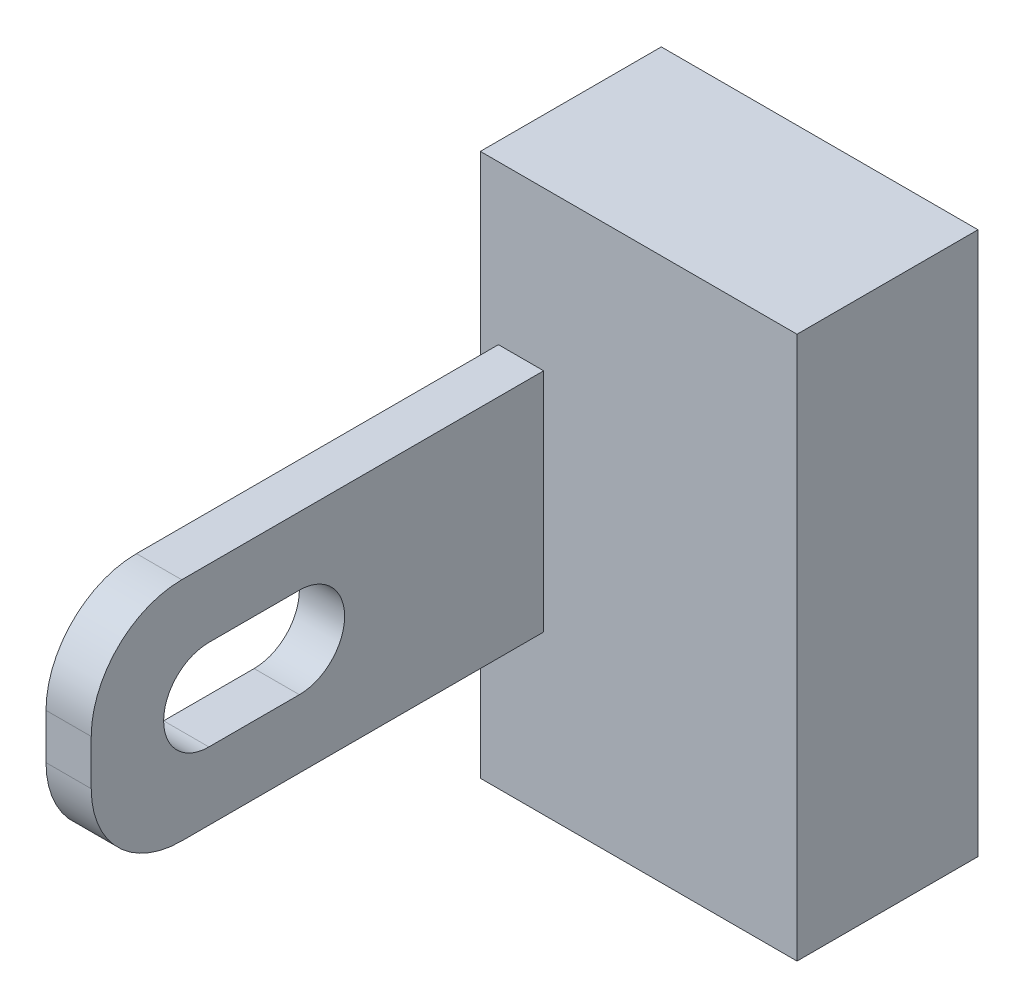
ISO-10303-21;
HEADER;
FILE_DESCRIPTION(('STEP AP214'),'2;1');
FILE_NAME('part.step','',(''),(''),'','','');
FILE_SCHEMA(('AUTOMOTIVE_DESIGN { 1 0 10303 214 1 1 1 1 }'));
ENDSEC;
DATA;
#1=APPLICATION_CONTEXT('core data for automotive mechanical design processes');
#2=APPLICATION_PROTOCOL_DEFINITION('international standard','automotive_design',2000,#1);
#3=PRODUCT_CONTEXT('',#1,'mechanical');
#4=PRODUCT('Part','Part','',(#3));
#5=PRODUCT_RELATED_PRODUCT_CATEGORY('part','',(#4));
#6=PRODUCT_DEFINITION_FORMATION('','',#4);
#7=PRODUCT_DEFINITION_CONTEXT('part definition',#1,'design');
#8=PRODUCT_DEFINITION('design','',#6,#7);
#9=PRODUCT_DEFINITION_SHAPE('','',#8);
#10=(LENGTH_UNIT() NAMED_UNIT(*) SI_UNIT(.MILLI.,.METRE.));
#11=(NAMED_UNIT(*) PLANE_ANGLE_UNIT() SI_UNIT($,.RADIAN.));
#12=(NAMED_UNIT(*) SI_UNIT($,.STERADIAN.) SOLID_ANGLE_UNIT());
#13=UNCERTAINTY_MEASURE_WITH_UNIT(LENGTH_MEASURE(1.E-05),#10,'distance_accuracy_value','');
#14=(GEOMETRIC_REPRESENTATION_CONTEXT(3) GLOBAL_UNCERTAINTY_ASSIGNED_CONTEXT((#13)) GLOBAL_UNIT_ASSIGNED_CONTEXT((#10,
#11,#12)) REPRESENTATION_CONTEXT('',''));
#15=CARTESIAN_POINT('',(0.,0.,0.));
#16=DIRECTION('',(0.,0.,1.));
#17=DIRECTION('',(1.,0.,0.));
#18=AXIS2_PLACEMENT_3D('',#15,#16,#17);
#19=CARTESIAN_POINT('',(0.,0.,2.));
#20=DIRECTION('',(0.,0.,1.));
#21=DIRECTION('',(1.,0.,0.));
#22=AXIS2_PLACEMENT_3D('',#19,#20,#21);
#23=PLANE('',#22);
#24=DIRECTION('',(0.,1.,0.));
#25=VECTOR('',#24,1.);
#26=CARTESIAN_POINT('',(1.75,3.,2.));
#27=LINE('',#26,#25);
#28=CARTESIAN_POINT('',(1.75,-3.,2.));
#29=VERTEX_POINT('',#28);
#30=CARTESIAN_POINT('',(1.75,3.,2.));
#31=VERTEX_POINT('',#30);
#32=EDGE_CURVE('E227',#29,#31,#27,.T.);
#33=ORIENTED_EDGE('',*,*,#32,.T.);
#34=DIRECTION('',(-1.,0.,0.));
#35=VECTOR('',#34,1.);
#36=CARTESIAN_POINT('',(-1.75,3.,2.));
#37=LINE('',#36,#35);
#38=CARTESIAN_POINT('',(-1.75,3.,2.));
#39=VERTEX_POINT('',#38);
#40=EDGE_CURVE('E231',#31,#39,#37,.T.);
#41=ORIENTED_EDGE('',*,*,#40,.T.);
#42=DIRECTION('',(0.,-1.,0.));
#43=VECTOR('',#42,1.);
#44=CARTESIAN_POINT('',(-1.75,3.,2.));
#45=LINE('',#44,#43);
#46=CARTESIAN_POINT('',(-1.75,-3.,2.));
#47=VERTEX_POINT('',#46);
#48=EDGE_CURVE('E235',#39,#47,#45,.T.);
#49=ORIENTED_EDGE('',*,*,#48,.T.);
#50=DIRECTION('',(1.,0.,0.));
#51=VECTOR('',#50,1.);
#52=CARTESIAN_POINT('',(-1.75,-3.,2.));
#53=LINE('',#52,#51);
#54=EDGE_CURVE('E238',#47,#29,#53,.T.);
#55=ORIENTED_EDGE('',*,*,#54,.T.);
#56=EDGE_LOOP('',(#33,#41,#49,#55));
#57=FACE_BOUND('',#56,.T.);
#58=DIRECTION('',(-1.,0.,0.));
#59=VECTOR('',#58,1.);
#60=CARTESIAN_POINT('',(-1.55,1.25,2.));
#61=LINE('',#60,#59);
#62=CARTESIAN_POINT('',(-1.05,1.25,2.));
#63=VERTEX_POINT('',#62);
#64=CARTESIAN_POINT('',(-1.55,1.25,2.));
#65=VERTEX_POINT('',#64);
#66=EDGE_CURVE('E204',#63,#65,#61,.T.);
#67=ORIENTED_EDGE('',*,*,#66,.F.);
#68=DIRECTION('',(0.,1.,0.));
#69=VECTOR('',#68,1.);
#70=CARTESIAN_POINT('',(-1.05,1.25,2.));
#71=LINE('',#70,#69);
#72=CARTESIAN_POINT('',(-1.05,-1.25,2.));
#73=VERTEX_POINT('',#72);
#74=EDGE_CURVE('E190',#73,#63,#71,.T.);
#75=ORIENTED_EDGE('',*,*,#74,.F.);
#76=DIRECTION('',(1.,0.,0.));
#77=VECTOR('',#76,1.);
#78=CARTESIAN_POINT('',(-1.55,-1.25,2.));
#79=LINE('',#78,#77);
#80=CARTESIAN_POINT('',(-1.55,-1.25,2.));
#81=VERTEX_POINT('',#80);
#82=EDGE_CURVE('E196',#81,#73,#79,.T.);
#83=ORIENTED_EDGE('',*,*,#82,.F.);
#84=DIRECTION('',(0.,-1.,0.));
#85=VECTOR('',#84,1.);
#86=CARTESIAN_POINT('',(-1.55,1.25,2.));
#87=LINE('',#86,#85);
#88=EDGE_CURVE('E208',#65,#81,#87,.T.);
#89=ORIENTED_EDGE('',*,*,#88,.F.);
#90=EDGE_LOOP('',(#67,#75,#83,#89));
#91=FACE_BOUND('',#90,.T.);
#92=ADVANCED_FACE('F41',(#57,#91),#23,.T.);
#93=CARTESIAN_POINT('',(1.75,3.,2.));
#94=DIRECTION('',(-1.,0.,0.));
#95=DIRECTION('',(0.,-1.,0.));
#96=AXIS2_PLACEMENT_3D('',#93,#94,#95);
#97=PLANE('',#96);
#98=DIRECTION('',(0.,1.,0.));
#99=VECTOR('',#98,1.);
#100=CARTESIAN_POINT('',(1.75,3.,0.));
#101=LINE('',#100,#99);
#102=CARTESIAN_POINT('',(1.75,-3.,0.));
#103=VERTEX_POINT('',#102);
#104=CARTESIAN_POINT('',(1.75,3.,0.));
#105=VERTEX_POINT('',#104);
#106=EDGE_CURVE('E226',#103,#105,#101,.T.);
#107=ORIENTED_EDGE('',*,*,#106,.T.);
#108=DIRECTION('',(0.,0.,-1.));
#109=VECTOR('',#108,1.);
#110=CARTESIAN_POINT('',(1.75,3.,2.));
#111=LINE('',#110,#109);
#112=EDGE_CURVE('E264',#31,#105,#111,.T.);
#113=ORIENTED_EDGE('',*,*,#112,.F.);
#114=ORIENTED_EDGE('',*,*,#32,.F.);
#115=DIRECTION('',(0.,0.,-1.));
#116=VECTOR('',#115,1.);
#117=CARTESIAN_POINT('',(1.75,-3.,2.));
#118=LINE('',#117,#116);
#119=EDGE_CURVE('E241',#29,#103,#118,.T.);
#120=ORIENTED_EDGE('',*,*,#119,.T.);
#121=EDGE_LOOP('',(#107,#113,#114,#120));
#122=FACE_BOUND('',#121,.T.);
#123=ADVANCED_FACE('F327',(#122),#97,.F.);
#124=CARTESIAN_POINT('',(-1.75,3.,2.));
#125=DIRECTION('',(0.,-1.,0.));
#126=DIRECTION('',(0.,0.,-1.));
#127=AXIS2_PLACEMENT_3D('',#124,#125,#126);
#128=PLANE('',#127);
#129=DIRECTION('',(-1.,0.,0.));
#130=VECTOR('',#129,1.);
#131=CARTESIAN_POINT('',(-1.75,3.,0.));
#132=LINE('',#131,#130);
#133=CARTESIAN_POINT('',(-1.75,3.,0.));
#134=VERTEX_POINT('',#133);
#135=EDGE_CURVE('E245',#105,#134,#132,.T.);
#136=ORIENTED_EDGE('',*,*,#135,.T.);
#137=DIRECTION('',(0.,0.,-1.));
#138=VECTOR('',#137,1.);
#139=CARTESIAN_POINT('',(-1.75,3.,2.));
#140=LINE('',#139,#138);
#141=EDGE_CURVE('E260',#39,#134,#140,.T.);
#142=ORIENTED_EDGE('',*,*,#141,.F.);
#143=ORIENTED_EDGE('',*,*,#40,.F.);
#144=ORIENTED_EDGE('',*,*,#112,.T.);
#145=EDGE_LOOP('',(#136,#142,#143,#144));
#146=FACE_BOUND('',#145,.T.);
#147=ADVANCED_FACE('F333',(#146),#128,.F.);
#148=CARTESIAN_POINT('',(-1.75,3.,2.));
#149=DIRECTION('',(1.,0.,0.));
#150=DIRECTION('',(0.,1.,0.));
#151=AXIS2_PLACEMENT_3D('',#148,#149,#150);
#152=PLANE('',#151);
#153=DIRECTION('',(0.,-1.,0.));
#154=VECTOR('',#153,1.);
#155=CARTESIAN_POINT('',(-1.75,3.,0.));
#156=LINE('',#155,#154);
#157=CARTESIAN_POINT('',(-1.75,-3.,0.));
#158=VERTEX_POINT('',#157);
#159=EDGE_CURVE('E248',#134,#158,#156,.T.);
#160=ORIENTED_EDGE('',*,*,#159,.T.);
#161=DIRECTION('',(0.,0.,-1.));
#162=VECTOR('',#161,1.);
#163=CARTESIAN_POINT('',(-1.75,-3.,2.));
#164=LINE('',#163,#162);
#165=EDGE_CURVE('E256',#47,#158,#164,.T.);
#166=ORIENTED_EDGE('',*,*,#165,.F.);
#167=ORIENTED_EDGE('',*,*,#48,.F.);
#168=ORIENTED_EDGE('',*,*,#141,.T.);
#169=EDGE_LOOP('',(#160,#166,#167,#168));
#170=FACE_BOUND('',#169,.T.);
#171=ADVANCED_FACE('F343',(#170),#152,.F.);
#172=CARTESIAN_POINT('',(-1.75,-3.,2.));
#173=DIRECTION('',(0.,1.,0.));
#174=DIRECTION('',(0.,0.,1.));
#175=AXIS2_PLACEMENT_3D('',#172,#173,#174);
#176=PLANE('',#175);
#177=DIRECTION('',(1.,0.,0.));
#178=VECTOR('',#177,1.);
#179=CARTESIAN_POINT('',(-1.75,-3.,0.));
#180=LINE('',#179,#178);
#181=EDGE_CURVE('E232',#158,#103,#180,.T.);
#182=ORIENTED_EDGE('',*,*,#181,.T.);
#183=ORIENTED_EDGE('',*,*,#119,.F.);
#184=ORIENTED_EDGE('',*,*,#54,.F.);
#185=ORIENTED_EDGE('',*,*,#165,.T.);
#186=EDGE_LOOP('',(#182,#183,#184,#185));
#187=FACE_BOUND('',#186,.T.);
#188=ADVANCED_FACE('F339',(#187),#176,.F.);
#189=CARTESIAN_POINT('',(0.,0.,0.));
#190=DIRECTION('',(0.,0.,1.));
#191=DIRECTION('',(1.,0.,0.));
#192=AXIS2_PLACEMENT_3D('',#189,#190,#191);
#193=PLANE('',#192);
#194=ORIENTED_EDGE('',*,*,#106,.F.);
#195=ORIENTED_EDGE('',*,*,#181,.F.);
#196=ORIENTED_EDGE('',*,*,#159,.F.);
#197=ORIENTED_EDGE('',*,*,#135,.F.);
#198=EDGE_LOOP('',(#194,#195,#196,#197));
#199=FACE_BOUND('',#198,.T.);
#200=ADVANCED_FACE('F323',(#199),#193,.F.);
#201=CARTESIAN_POINT('',(-1.05,1.25,7.));
#202=DIRECTION('',(-1.,0.,0.));
#203=DIRECTION('',(0.,-1.,0.));
#204=AXIS2_PLACEMENT_3D('',#201,#202,#203);
#205=PLANE('',#204);
#206=DIRECTION('',(0.,0.,-1.));
#207=VECTOR('',#206,1.);
#208=CARTESIAN_POINT('',(-1.05,0.5,7.));
#209=LINE('',#208,#207);
#210=CARTESIAN_POINT('',(-1.05,0.5,5.7));
#211=VERTEX_POINT('',#210);
#212=CARTESIAN_POINT('',(-1.05,0.5,4.7));
#213=VERTEX_POINT('',#212);
#214=EDGE_CURVE('E182',#211,#213,#209,.T.);
#215=ORIENTED_EDGE('',*,*,#214,.T.);
#216=CARTESIAN_POINT('',(-1.05,0.,4.7));
#217=DIRECTION('',(-1.,0.,0.));
#218=DIRECTION('',(0.,-1.,0.));
#219=AXIS2_PLACEMENT_3D('',#216,#217,#218);
#220=CIRCLE('',#219,0.5);
#221=CARTESIAN_POINT('',(-1.05,-0.5,4.7));
#222=VERTEX_POINT('',#221);
#223=EDGE_CURVE('E186',#213,#222,#220,.T.);
#224=ORIENTED_EDGE('',*,*,#223,.T.);
#225=DIRECTION('',(0.,0.,1.));
#226=VECTOR('',#225,1.);
#227=CARTESIAN_POINT('',(-1.05,-0.5,7.));
#228=LINE('',#227,#226);
#229=CARTESIAN_POINT('',(-1.05,-0.5,5.7));
#230=VERTEX_POINT('',#229);
#231=EDGE_CURVE('E173',#222,#230,#228,.T.);
#232=ORIENTED_EDGE('',*,*,#231,.T.);
#233=CARTESIAN_POINT('',(-1.05,0.,5.7));
#234=DIRECTION('',(-1.,0.,0.));
#235=DIRECTION('',(0.,-1.,0.));
#236=AXIS2_PLACEMENT_3D('',#233,#234,#235);
#237=CIRCLE('',#236,0.5);
#238=EDGE_CURVE('E148',#230,#211,#237,.T.);
#239=ORIENTED_EDGE('',*,*,#238,.T.);
#240=EDGE_LOOP('',(#215,#224,#232,#239));
#241=FACE_BOUND('',#240,.T.);
#242=DIRECTION('',(0.,1.,0.));
#243=VECTOR('',#242,1.);
#244=CARTESIAN_POINT('',(-1.05,1.25,7.));
#245=LINE('',#244,#243);
#246=CARTESIAN_POINT('',(-1.05,-0.25,7.));
#247=VERTEX_POINT('',#246);
#248=CARTESIAN_POINT('',(-1.05,0.25,7.));
#249=VERTEX_POINT('',#248);
#250=EDGE_CURVE('E191',#247,#249,#245,.T.);
#251=ORIENTED_EDGE('',*,*,#250,.F.);
#252=CARTESIAN_POINT('',(-1.05,-0.25,6.));
#253=DIRECTION('',(-1.,0.,0.));
#254=DIRECTION('',(0.,-1.,0.));
#255=AXIS2_PLACEMENT_3D('',#252,#253,#254);
#256=CIRCLE('',#255,1.);
#257=CARTESIAN_POINT('',(-1.05,-1.25,6.));
#258=VERTEX_POINT('',#257);
#259=EDGE_CURVE('E279',#247,#258,#256,.F.);
#260=ORIENTED_EDGE('',*,*,#259,.T.);
#261=DIRECTION('',(0.,0.,-1.));
#262=VECTOR('',#261,1.);
#263=CARTESIAN_POINT('',(-1.05,-1.25,7.));
#264=LINE('',#263,#262);
#265=EDGE_CURVE('E200',#258,#73,#264,.T.);
#266=ORIENTED_EDGE('',*,*,#265,.T.);
#267=ORIENTED_EDGE('',*,*,#74,.T.);
#268=DIRECTION('',(0.,0.,-1.));
#269=VECTOR('',#268,1.);
#270=CARTESIAN_POINT('',(-1.05,1.25,7.));
#271=LINE('',#270,#269);
#272=CARTESIAN_POINT('',(-1.05,1.25,6.));
#273=VERTEX_POINT('',#272);
#274=EDGE_CURVE('E223',#273,#63,#271,.T.);
#275=ORIENTED_EDGE('',*,*,#274,.F.);
#276=CARTESIAN_POINT('',(-1.05,0.25,6.));
#277=DIRECTION('',(-1.,0.,0.));
#278=DIRECTION('',(0.,-1.,0.));
#279=AXIS2_PLACEMENT_3D('',#276,#277,#278);
#280=CIRCLE('',#279,1.);
#281=EDGE_CURVE('E276',#273,#249,#280,.F.);
#282=ORIENTED_EDGE('',*,*,#281,.T.);
#283=EDGE_LOOP('',(#251,#260,#266,#267,#275,#282));
#284=FACE_BOUND('',#283,.T.);
#285=ADVANCED_FACE('F301',(#241,#284),#205,.F.);
#286=CARTESIAN_POINT('',(-1.55,1.25,7.));
#287=DIRECTION('',(0.,-1.,0.));
#288=DIRECTION('',(0.,0.,-1.));
#289=AXIS2_PLACEMENT_3D('',#286,#287,#288);
#290=PLANE('',#289);
#291=DIRECTION('',(0.,0.,-1.));
#292=VECTOR('',#291,1.);
#293=CARTESIAN_POINT('',(-1.55,1.25,7.));
#294=LINE('',#293,#292);
#295=CARTESIAN_POINT('',(-1.55,1.25,6.));
#296=VERTEX_POINT('',#295);
#297=EDGE_CURVE('E220',#296,#65,#294,.T.);
#298=ORIENTED_EDGE('',*,*,#297,.F.);
#299=DIRECTION('',(-1.,0.,0.));
#300=VECTOR('',#299,1.);
#301=CARTESIAN_POINT('',(-1.05,1.25,6.));
#302=LINE('',#301,#300);
#303=EDGE_CURVE('E11',#296,#273,#302,.F.);
#304=ORIENTED_EDGE('',*,*,#303,.T.);
#305=ORIENTED_EDGE('',*,*,#274,.T.);
#306=ORIENTED_EDGE('',*,*,#66,.T.);
#307=EDGE_LOOP('',(#298,#304,#305,#306));
#308=FACE_BOUND('',#307,.T.);
#309=ADVANCED_FACE('F315',(#308),#290,.F.);
#310=CARTESIAN_POINT('',(-1.55,1.25,7.));
#311=DIRECTION('',(1.,0.,0.));
#312=DIRECTION('',(0.,0.,-1.));
#313=AXIS2_PLACEMENT_3D('',#310,#311,#312);
#314=PLANE('',#313);
#315=DIRECTION('',(0.,0.,1.));
#316=VECTOR('',#315,1.);
#317=CARTESIAN_POINT('',(-1.55,-0.5,4.7));
#318=LINE('',#317,#316);
#319=CARTESIAN_POINT('',(-1.55,-0.5,4.7));
#320=VERTEX_POINT('',#319);
#321=CARTESIAN_POINT('',(-1.55,-0.5,5.7));
#322=VERTEX_POINT('',#321);
#323=EDGE_CURVE('E155',#320,#322,#318,.T.);
#324=ORIENTED_EDGE('',*,*,#323,.F.);
#325=CARTESIAN_POINT('',(-1.55,0.,4.7));
#326=DIRECTION('',(-1.,0.,0.));
#327=DIRECTION('',(0.,0.,1.));
#328=AXIS2_PLACEMENT_3D('',#325,#326,#327);
#329=CIRCLE('',#328,0.5);
#330=CARTESIAN_POINT('',(-1.55,0.5,4.7));
#331=VERTEX_POINT('',#330);
#332=EDGE_CURVE('E65',#331,#320,#329,.T.);
#333=ORIENTED_EDGE('',*,*,#332,.F.);
#334=DIRECTION('',(0.,0.,-1.));
#335=VECTOR('',#334,1.);
#336=CARTESIAN_POINT('',(-1.55,0.5,4.7));
#337=LINE('',#336,#335);
#338=CARTESIAN_POINT('',(-1.55,0.5,5.7));
#339=VERTEX_POINT('',#338);
#340=EDGE_CURVE('E163',#339,#331,#337,.T.);
#341=ORIENTED_EDGE('',*,*,#340,.F.);
#342=CARTESIAN_POINT('',(-1.55,0.,5.7));
#343=DIRECTION('',(-1.,0.,0.));
#344=DIRECTION('',(0.,0.,1.));
#345=AXIS2_PLACEMENT_3D('',#342,#343,#344);
#346=CIRCLE('',#345,0.5);
#347=EDGE_CURVE('E145',#322,#339,#346,.T.);
#348=ORIENTED_EDGE('',*,*,#347,.F.);
#349=EDGE_LOOP('',(#324,#333,#341,#348));
#350=FACE_BOUND('',#349,.T.);
#351=DIRECTION('',(0.,0.,-1.));
#352=VECTOR('',#351,1.);
#353=CARTESIAN_POINT('',(-1.55,-1.25,7.));
#354=LINE('',#353,#352);
#355=CARTESIAN_POINT('',(-1.55,-1.25,6.));
#356=VERTEX_POINT('',#355);
#357=EDGE_CURVE('E217',#356,#81,#354,.T.);
#358=ORIENTED_EDGE('',*,*,#357,.F.);
#359=CARTESIAN_POINT('',(-1.55,-0.25,6.));
#360=DIRECTION('',(1.,0.,0.));
#361=DIRECTION('',(0.,0.,-1.));
#362=AXIS2_PLACEMENT_3D('',#359,#360,#361);
#363=CIRCLE('',#362,1.);
#364=CARTESIAN_POINT('',(-1.55,-0.25,7.));
#365=VERTEX_POINT('',#364);
#366=EDGE_CURVE('E50',#356,#365,#363,.F.);
#367=ORIENTED_EDGE('',*,*,#366,.T.);
#368=DIRECTION('',(0.,-1.,0.));
#369=VECTOR('',#368,1.);
#370=CARTESIAN_POINT('',(-1.55,1.25,7.));
#371=LINE('',#370,#369);
#372=CARTESIAN_POINT('',(-1.55,0.25,7.));
#373=VERTEX_POINT('',#372);
#374=EDGE_CURVE('E195',#373,#365,#371,.T.);
#375=ORIENTED_EDGE('',*,*,#374,.F.);
#376=CARTESIAN_POINT('',(-1.55,0.25,6.));
#377=DIRECTION('',(1.,0.,0.));
#378=DIRECTION('',(0.,0.,-1.));
#379=AXIS2_PLACEMENT_3D('',#376,#377,#378);
#380=CIRCLE('',#379,1.);
#381=EDGE_CURVE('E285',#373,#296,#380,.F.);
#382=ORIENTED_EDGE('',*,*,#381,.T.);
#383=ORIENTED_EDGE('',*,*,#297,.T.);
#384=ORIENTED_EDGE('',*,*,#88,.T.);
#385=EDGE_LOOP('',(#358,#367,#375,#382,#383,#384));
#386=FACE_BOUND('',#385,.T.);
#387=ADVANCED_FACE('F160',(#350,#386),#314,.F.);
#388=CARTESIAN_POINT('',(-1.55,-1.25,7.));
#389=DIRECTION('',(0.,1.,0.));
#390=DIRECTION('',(0.,0.,1.));
#391=AXIS2_PLACEMENT_3D('',#388,#389,#390);
#392=PLANE('',#391);
#393=ORIENTED_EDGE('',*,*,#265,.F.);
#394=DIRECTION('',(1.,0.,0.));
#395=VECTOR('',#394,1.);
#396=CARTESIAN_POINT('',(-1.55,-1.25,6.));
#397=LINE('',#396,#395);
#398=EDGE_CURVE('E282',#258,#356,#397,.F.);
#399=ORIENTED_EDGE('',*,*,#398,.T.);
#400=ORIENTED_EDGE('',*,*,#357,.T.);
#401=ORIENTED_EDGE('',*,*,#82,.T.);
#402=EDGE_LOOP('',(#393,#399,#400,#401));
#403=FACE_BOUND('',#402,.T.);
#404=ADVANCED_FACE('F303',(#403),#392,.F.);
#405=CARTESIAN_POINT('',(0.,0.,7.));
#406=DIRECTION('',(0.,0.,1.));
#407=DIRECTION('',(1.,0.,0.));
#408=AXIS2_PLACEMENT_3D('',#405,#406,#407);
#409=PLANE('',#408);
#410=ORIENTED_EDGE('',*,*,#374,.T.);
#411=DIRECTION('',(1.,0.,0.));
#412=VECTOR('',#411,1.);
#413=CARTESIAN_POINT('',(-1.05,-0.25,7.));
#414=LINE('',#413,#412);
#415=EDGE_CURVE('E272',#365,#247,#414,.T.);
#416=ORIENTED_EDGE('',*,*,#415,.T.);
#417=ORIENTED_EDGE('',*,*,#250,.T.);
#418=DIRECTION('',(-1.,0.,0.));
#419=VECTOR('',#418,1.);
#420=CARTESIAN_POINT('',(-1.55,0.25,7.));
#421=LINE('',#420,#419);
#422=EDGE_CURVE('E268',#249,#373,#421,.T.);
#423=ORIENTED_EDGE('',*,*,#422,.T.);
#424=EDGE_LOOP('',(#410,#416,#417,#423));
#425=FACE_BOUND('',#424,.T.);
#426=ADVANCED_FACE('F295',(#425),#409,.T.);
#427=CARTESIAN_POINT('',(0.,-0.25,6.));
#428=DIRECTION('',(-1.,0.,0.));
#429=DIRECTION('',(0.,0.,1.));
#430=AXIS2_PLACEMENT_3D('',#427,#428,#429);
#431=CYLINDRICAL_SURFACE('',#430,1.);
#432=ORIENTED_EDGE('',*,*,#366,.F.);
#433=ORIENTED_EDGE('',*,*,#398,.F.);
#434=ORIENTED_EDGE('',*,*,#259,.F.);
#435=ORIENTED_EDGE('',*,*,#415,.F.);
#436=EDGE_LOOP('',(#432,#433,#434,#435));
#437=FACE_BOUND('',#436,.T.);
#438=ADVANCED_FACE('F298',(#437),#431,.T.);
#439=CARTESIAN_POINT('',(0.,0.25,6.));
#440=DIRECTION('',(1.,0.,0.));
#441=DIRECTION('',(0.,0.,-1.));
#442=AXIS2_PLACEMENT_3D('',#439,#440,#441);
#443=CYLINDRICAL_SURFACE('',#442,1.);
#444=ORIENTED_EDGE('',*,*,#281,.F.);
#445=ORIENTED_EDGE('',*,*,#303,.F.);
#446=ORIENTED_EDGE('',*,*,#381,.F.);
#447=ORIENTED_EDGE('',*,*,#422,.F.);
#448=EDGE_LOOP('',(#444,#445,#446,#447));
#449=FACE_BOUND('',#448,.T.);
#450=ADVANCED_FACE('F43',(#449),#443,.T.);
#451=CARTESIAN_POINT('',(1.75,0.,4.7));
#452=DIRECTION('',(-1.,0.,0.));
#453=DIRECTION('',(0.,0.,1.));
#454=AXIS2_PLACEMENT_3D('',#451,#452,#453);
#455=CYLINDRICAL_SURFACE('',#454,0.5);
#456=DIRECTION('',(-1.,0.,0.));
#457=VECTOR('',#456,1.);
#458=CARTESIAN_POINT('',(1.75,0.5,4.7));
#459=LINE('',#458,#457);
#460=EDGE_CURVE('E170',#213,#331,#459,.T.);
#461=ORIENTED_EDGE('',*,*,#460,.T.);
#462=ORIENTED_EDGE('',*,*,#332,.T.);
#463=DIRECTION('',(-1.,0.,0.));
#464=VECTOR('',#463,1.);
#465=CARTESIAN_POINT('',(1.75,-0.5,4.7));
#466=LINE('',#465,#464);
#467=EDGE_CURVE('E152',#222,#320,#466,.T.);
#468=ORIENTED_EDGE('',*,*,#467,.F.);
#469=ORIENTED_EDGE('',*,*,#223,.F.);
#470=EDGE_LOOP('',(#461,#462,#468,#469));
#471=FACE_BOUND('',#470,.T.);
#472=ADVANCED_FACE('F355',(#471),#455,.F.);
#473=CARTESIAN_POINT('',(1.75,0.5,4.7));
#474=DIRECTION('',(0.,1.,0.));
#475=DIRECTION('',(0.,0.,1.));
#476=AXIS2_PLACEMENT_3D('',#473,#474,#475);
#477=PLANE('',#476);
#478=DIRECTION('',(-1.,0.,0.));
#479=VECTOR('',#478,1.);
#480=CARTESIAN_POINT('',(1.75,0.5,5.7));
#481=LINE('',#480,#479);
#482=EDGE_CURVE('E151',#211,#339,#481,.T.);
#483=ORIENTED_EDGE('',*,*,#482,.T.);
#484=ORIENTED_EDGE('',*,*,#340,.T.);
#485=ORIENTED_EDGE('',*,*,#460,.F.);
#486=ORIENTED_EDGE('',*,*,#214,.F.);
#487=EDGE_LOOP('',(#483,#484,#485,#486));
#488=FACE_BOUND('',#487,.T.);
#489=ADVANCED_FACE('F364',(#488),#477,.F.);
#490=CARTESIAN_POINT('',(1.75,0.,5.7));
#491=DIRECTION('',(-1.,0.,0.));
#492=DIRECTION('',(0.,0.,1.));
#493=AXIS2_PLACEMENT_3D('',#490,#491,#492);
#494=CYLINDRICAL_SURFACE('',#493,0.5);
#495=DIRECTION('',(-1.,0.,0.));
#496=VECTOR('',#495,1.);
#497=CARTESIAN_POINT('',(1.75,-0.5,5.7));
#498=LINE('',#497,#496);
#499=EDGE_CURVE('E57',#230,#322,#498,.T.);
#500=ORIENTED_EDGE('',*,*,#499,.T.);
#501=ORIENTED_EDGE('',*,*,#347,.T.);
#502=ORIENTED_EDGE('',*,*,#482,.F.);
#503=ORIENTED_EDGE('',*,*,#238,.F.);
#504=EDGE_LOOP('',(#500,#501,#502,#503));
#505=FACE_BOUND('',#504,.T.);
#506=ADVANCED_FACE('F142',(#505),#494,.F.);
#507=CARTESIAN_POINT('',(1.75,-0.5,4.7));
#508=DIRECTION('',(0.,-1.,0.));
#509=DIRECTION('',(0.,0.,-1.));
#510=AXIS2_PLACEMENT_3D('',#507,#508,#509);
#511=PLANE('',#510);
#512=ORIENTED_EDGE('',*,*,#467,.T.);
#513=ORIENTED_EDGE('',*,*,#323,.T.);
#514=ORIENTED_EDGE('',*,*,#499,.F.);
#515=ORIENTED_EDGE('',*,*,#231,.F.);
#516=EDGE_LOOP('',(#512,#513,#514,#515));
#517=FACE_BOUND('',#516,.T.);
#518=ADVANCED_FACE('F156',(#517),#511,.F.);
#519=CLOSED_SHELL('',(#92,#123,#147,#171,#188,#200,#285,#309,#387,#404,#426,#438,#450,#472,#489,
#506,#518));
#520=MANIFOLD_SOLID_BREP('B2',#519);
#521=ADVANCED_BREP_SHAPE_REPRESENTATION('',(#18,#520),#14);
#522=SHAPE_DEFINITION_REPRESENTATION(#9,#521);
ENDSEC;
END-ISO-10303-21;
